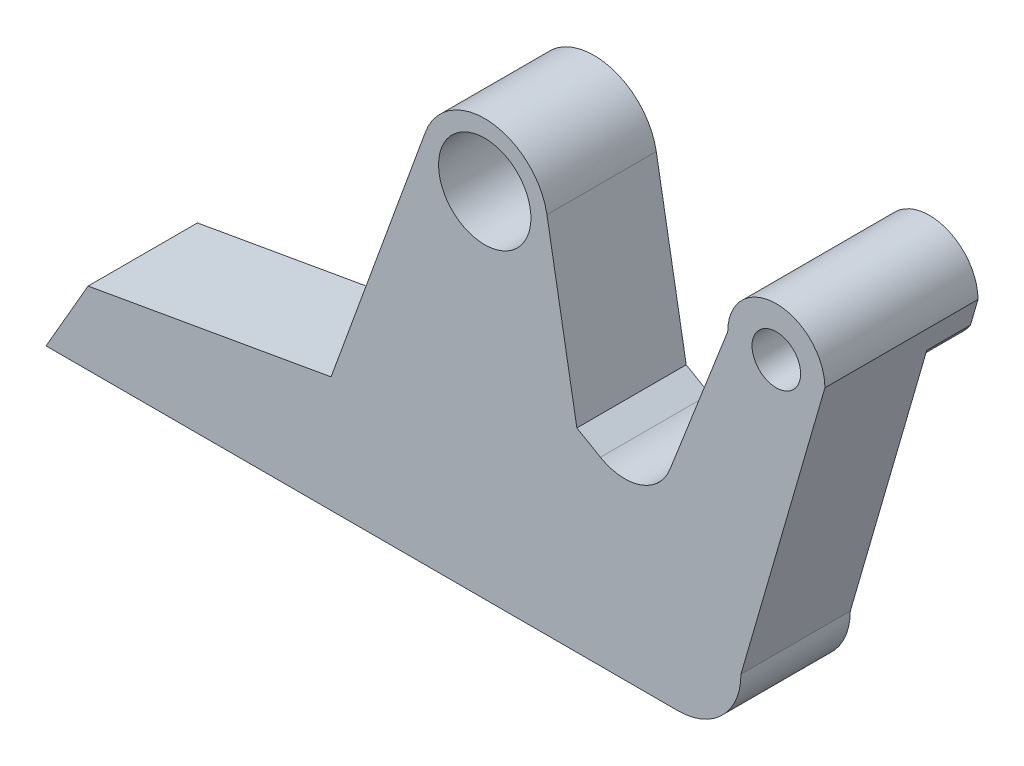
ISO-10303-21;
HEADER;
FILE_DESCRIPTION(('STEP AP214'),'2;1');
FILE_NAME('part.step','',(''),(''),'','','');
FILE_SCHEMA(('AUTOMOTIVE_DESIGN { 1 0 10303 214 1 1 1 1 }'));
ENDSEC;
DATA;
#1=APPLICATION_CONTEXT('core data for automotive mechanical design processes');
#2=APPLICATION_PROTOCOL_DEFINITION('international standard','automotive_design',2000,#1);
#3=PRODUCT_CONTEXT('',#1,'mechanical');
#4=PRODUCT('Part','Part','',(#3));
#5=PRODUCT_RELATED_PRODUCT_CATEGORY('part','',(#4));
#6=PRODUCT_DEFINITION_FORMATION('','',#4);
#7=PRODUCT_DEFINITION_CONTEXT('part definition',#1,'design');
#8=PRODUCT_DEFINITION('design','',#6,#7);
#9=PRODUCT_DEFINITION_SHAPE('','',#8);
#10=(LENGTH_UNIT() NAMED_UNIT(*) SI_UNIT(.MILLI.,.METRE.));
#11=(NAMED_UNIT(*) PLANE_ANGLE_UNIT() SI_UNIT($,.RADIAN.));
#12=(NAMED_UNIT(*) SI_UNIT($,.STERADIAN.) SOLID_ANGLE_UNIT());
#13=UNCERTAINTY_MEASURE_WITH_UNIT(LENGTH_MEASURE(1.E-05),#10,'distance_accuracy_value','');
#14=(GEOMETRIC_REPRESENTATION_CONTEXT(3) GLOBAL_UNCERTAINTY_ASSIGNED_CONTEXT((#13)) GLOBAL_UNIT_ASSIGNED_CONTEXT((#10,
#11,#12)) REPRESENTATION_CONTEXT('',''));
#15=CARTESIAN_POINT('',(0.,0.,0.));
#16=DIRECTION('',(0.,0.,1.));
#17=DIRECTION('',(1.,0.,0.));
#18=AXIS2_PLACEMENT_3D('',#15,#16,#17);
#19=CARTESIAN_POINT('',(0.,0.,-22.5));
#20=DIRECTION('',(0.866025403784436,-0.500000000000004,0.));
#21=DIRECTION('',(0.500000000000004,0.866025403784436,0.));
#22=AXIS2_PLACEMENT_3D('',#19,#20,#21);
#23=PLANE('',#22);
#24=DIRECTION('',(-0.500000000000004,-0.866025403784436,0.));
#25=VECTOR('',#24,1.);
#26=CARTESIAN_POINT('',(0.,0.,-8.24999999999999));
#27=LINE('',#26,#25);
#28=CARTESIAN_POINT('',(1.73205080756889,3.,-8.24999999999999));
#29=VERTEX_POINT('',#28);
#30=CARTESIAN_POINT('',(0.,0.,-8.24999999999999));
#31=VERTEX_POINT('',#30);
#32=EDGE_CURVE('E278',#29,#31,#27,.T.);
#33=ORIENTED_EDGE('',*,*,#32,.T.);
#34=DIRECTION('',(0.,0.,1.));
#35=VECTOR('',#34,1.);
#36=CARTESIAN_POINT('',(0.,0.,-22.5));
#37=LINE('',#36,#35);
#38=CARTESIAN_POINT('',(0.,0.,0.));
#39=VERTEX_POINT('',#38);
#40=EDGE_CURVE('E348',#31,#39,#37,.T.);
#41=ORIENTED_EDGE('',*,*,#40,.T.);
#42=DIRECTION('',(-0.500000000000004,-0.866025403784436,0.));
#43=VECTOR('',#42,1.);
#44=CARTESIAN_POINT('',(0.,0.,0.));
#45=LINE('',#44,#43);
#46=CARTESIAN_POINT('',(8.66025403784448,15.,0.));
#47=VERTEX_POINT('',#46);
#48=EDGE_CURVE('E334',#47,#39,#45,.T.);
#49=ORIENTED_EDGE('',*,*,#48,.F.);
#50=DIRECTION('',(0.,0.,1.));
#51=VECTOR('',#50,1.);
#52=CARTESIAN_POINT('',(8.66025403784448,15.,-22.5));
#53=LINE('',#52,#51);
#54=CARTESIAN_POINT('',(8.66025403784448,15.,-22.5));
#55=VERTEX_POINT('',#54);
#56=EDGE_CURVE('E352',#55,#47,#53,.T.);
#57=ORIENTED_EDGE('',*,*,#56,.F.);
#58=DIRECTION('',(-0.500000000000004,-0.866025403784436,0.));
#59=VECTOR('',#58,1.);
#60=CARTESIAN_POINT('',(0.,0.,-22.5));
#61=LINE('',#60,#59);
#62=CARTESIAN_POINT('',(0.,0.,-22.5));
#63=VERTEX_POINT('',#62);
#64=EDGE_CURVE('E302',#55,#63,#61,.T.);
#65=ORIENTED_EDGE('',*,*,#64,.T.);
#66=CARTESIAN_POINT('',(0.,0.,-14.25));
#67=VERTEX_POINT('',#66);
#68=EDGE_CURVE('E349',#63,#67,#37,.T.);
#69=ORIENTED_EDGE('',*,*,#68,.T.);
#70=DIRECTION('',(-0.500000000000004,-0.866025403784436,0.));
#71=VECTOR('',#70,1.);
#72=CARTESIAN_POINT('',(0.,0.,-14.25));
#73=LINE('',#72,#71);
#74=CARTESIAN_POINT('',(1.73205080756892,3.00000000000001,-14.25));
#75=VERTEX_POINT('',#74);
#76=EDGE_CURVE('E262',#75,#67,#73,.T.);
#77=ORIENTED_EDGE('',*,*,#76,.F.);
#78=DIRECTION('',(0.,0.,-1.));
#79=VECTOR('',#78,1.);
#80=CARTESIAN_POINT('',(1.7320508075689,3.,-22.5));
#81=LINE('',#80,#79);
#82=CARTESIAN_POINT('',(1.73205080756889,3.,-17.25));
#83=VERTEX_POINT('',#82);
#84=EDGE_CURVE('E374',#75,#83,#81,.T.);
#85=ORIENTED_EDGE('',*,*,#84,.T.);
#86=DIRECTION('',(-0.500000000000004,-0.866025403784436,0.));
#87=VECTOR('',#86,1.);
#88=CARTESIAN_POINT('',(0.,0.,-17.25));
#89=LINE('',#88,#87);
#90=CARTESIAN_POINT('',(3.46410161513783,6.00000000000001,-17.25));
#91=VERTEX_POINT('',#90);
#92=EDGE_CURVE('E377',#91,#83,#89,.T.);
#93=ORIENTED_EDGE('',*,*,#92,.F.);
#94=DIRECTION('',(0.,0.,-1.));
#95=VECTOR('',#94,1.);
#96=CARTESIAN_POINT('',(3.46410161513779,6.,-22.5));
#97=LINE('',#96,#95);
#98=CARTESIAN_POINT('',(3.4641016151378,6.,-5.25));
#99=VERTEX_POINT('',#98);
#100=EDGE_CURVE('E380',#99,#91,#97,.T.);
#101=ORIENTED_EDGE('',*,*,#100,.F.);
#102=DIRECTION('',(-0.500000000000004,-0.866025403784436,0.));
#103=VECTOR('',#102,1.);
#104=CARTESIAN_POINT('',(0.,0.,-5.25));
#105=LINE('',#104,#103);
#106=CARTESIAN_POINT('',(1.73205080756892,3.00000000000001,-5.25));
#107=VERTEX_POINT('',#106);
#108=EDGE_CURVE('E383',#99,#107,#105,.T.);
#109=ORIENTED_EDGE('',*,*,#108,.T.);
#110=DIRECTION('',(0.,0.,-1.));
#111=VECTOR('',#110,1.);
#112=CARTESIAN_POINT('',(1.7320508075689,3.,-22.5));
#113=LINE('',#112,#111);
#114=EDGE_CURVE('E386',#107,#29,#113,.T.);
#115=ORIENTED_EDGE('',*,*,#114,.T.);
#116=EDGE_LOOP('',(#33,#41,#49,#57,#65,#69,#77,#85,#93,#101,#109,#115));
#117=FACE_BOUND('',#116,.T.);
#118=ADVANCED_FACE('F75',(#117),#23,.F.);
#119=CARTESIAN_POINT('',(0.,0.,-22.5));
#120=DIRECTION('',(0.,1.,0.));
#121=DIRECTION('',(-1.,0.,0.));
#122=AXIS2_PLACEMENT_3D('',#119,#120,#121);
#123=PLANE('',#122);
#124=DIRECTION('',(-1.,0.,0.));
#125=VECTOR('',#124,1.);
#126=CARTESIAN_POINT('',(130.,0.,-8.24999999999999));
#127=LINE('',#126,#125);
#128=CARTESIAN_POINT('',(130.,0.,-8.25));
#129=VERTEX_POINT('',#128);
#130=EDGE_CURVE('E260',#129,#31,#127,.T.);
#131=ORIENTED_EDGE('',*,*,#130,.F.);
#132=DIRECTION('',(0.,0.,1.));
#133=VECTOR('',#132,1.);
#134=CARTESIAN_POINT('',(130.,0.,-22.5));
#135=LINE('',#134,#133);
#136=CARTESIAN_POINT('',(130.,0.,0.));
#137=VERTEX_POINT('',#136);
#138=EDGE_CURVE('E310',#129,#137,#135,.T.);
#139=ORIENTED_EDGE('',*,*,#138,.T.);
#140=DIRECTION('',(1.,0.,0.));
#141=VECTOR('',#140,1.);
#142=CARTESIAN_POINT('',(0.,0.,0.));
#143=LINE('',#142,#141);
#144=EDGE_CURVE('E337',#39,#137,#143,.T.);
#145=ORIENTED_EDGE('',*,*,#144,.F.);
#146=ORIENTED_EDGE('',*,*,#40,.F.);
#147=EDGE_LOOP('',(#131,#139,#145,#146));
#148=FACE_BOUND('',#147,.T.);
#149=ADVANCED_FACE('F440',(#148),#123,.F.);
#150=CARTESIAN_POINT('',(130.,13.,-22.5));
#151=DIRECTION('',(0.,0.,1.));
#152=DIRECTION('',(-1.,0.,0.));
#153=AXIS2_PLACEMENT_3D('',#150,#151,#152);
#154=CYLINDRICAL_SURFACE('',#153,13.);
#155=CARTESIAN_POINT('',(130.,13.,0.));
#156=DIRECTION('',(0.,0.,1.));
#157=DIRECTION('',(1.,0.,0.));
#158=AXIS2_PLACEMENT_3D('',#155,#156,#157);
#159=CIRCLE('',#158,13.);
#160=CARTESIAN_POINT('',(143.,13.,0.));
#161=VERTEX_POINT('',#160);
#162=EDGE_CURVE('E281',#137,#161,#159,.T.);
#163=ORIENTED_EDGE('',*,*,#162,.F.);
#164=ORIENTED_EDGE('',*,*,#138,.F.);
#165=DIRECTION('',(0.,0.,1.));
#166=VECTOR('',#165,1.);
#167=CARTESIAN_POINT('',(130.,0.,0.));
#168=LINE('',#167,#166);
#169=CARTESIAN_POINT('',(130.,0.,-14.25));
#170=VERTEX_POINT('',#169);
#171=EDGE_CURVE('E237',#170,#129,#168,.T.);
#172=ORIENTED_EDGE('',*,*,#171,.F.);
#173=CARTESIAN_POINT('',(130.,0.,-22.5));
#174=VERTEX_POINT('',#173);
#175=EDGE_CURVE('E345',#174,#170,#135,.T.);
#176=ORIENTED_EDGE('',*,*,#175,.F.);
#177=CARTESIAN_POINT('',(130.,13.,-22.5));
#178=DIRECTION('',(0.,0.,1.));
#179=DIRECTION('',(1.,0.,0.));
#180=AXIS2_PLACEMENT_3D('',#177,#178,#179);
#181=CIRCLE('',#180,13.);
#182=CARTESIAN_POINT('',(143.,13.,-22.5));
#183=VERTEX_POINT('',#182);
#184=EDGE_CURVE('E282',#174,#183,#181,.T.);
#185=ORIENTED_EDGE('',*,*,#184,.T.);
#186=DIRECTION('',(0.,0.,1.));
#187=VECTOR('',#186,1.);
#188=CARTESIAN_POINT('',(143.,13.,-22.5));
#189=LINE('',#188,#187);
#190=EDGE_CURVE('E371',#183,#161,#189,.T.);
#191=ORIENTED_EDGE('',*,*,#190,.T.);
#192=EDGE_LOOP('',(#163,#164,#172,#176,#185,#191));
#193=FACE_BOUND('',#192,.T.);
#194=ADVANCED_FACE('F415',(#193),#154,.T.);
#195=CARTESIAN_POINT('',(150.274249999417,72.6656318764519,-22.5));
#196=DIRECTION('',(0.,0.,1.));
#197=DIRECTION('',(-1.,0.,0.));
#198=AXIS2_PLACEMENT_3D('',#195,#196,#197);
#199=CYLINDRICAL_SURFACE('',#198,4.99999999999999);
#200=CARTESIAN_POINT('',(150.274249999417,72.6656318764519,0.));
#201=DIRECTION('',(0.,0.,1.));
#202=DIRECTION('',(1.,0.,0.));
#203=AXIS2_PLACEMENT_3D('',#200,#201,#202);
#204=CIRCLE('',#203,4.99999999999999);
#205=CARTESIAN_POINT('',(145.274249999417,72.6656318764519,0.));
#206=VERTEX_POINT('',#205);
#207=EDGE_CURVE('E285',#206,#206,#204,.T.);
#208=CARTESIAN_POINT('',(150.274249999417,72.6656318764519,-31.5));
#209=DIRECTION('',(0.,0.,1.));
#210=DIRECTION('',(1.,0.,0.));
#211=AXIS2_PLACEMENT_3D('',#208,#209,#210);
#212=CIRCLE('',#211,4.99999999999999);
#213=CARTESIAN_POINT('',(145.274249999417,72.6656318764519,-31.5));
#214=VERTEX_POINT('',#213);
#215=EDGE_CURVE('E229',#214,#214,#212,.F.);
#216=CARTESIAN_POINT('',(145.274249999417,72.6656318764519,0.));
#217=CARTESIAN_POINT('',(145.274249999417,72.6656318764519,-0.328125000000003));
#218=CARTESIAN_POINT('',(145.274249999417,72.6656318764519,-0.656250000000003));
#219=CARTESIAN_POINT('',(145.274249999417,72.6656318764519,-1.3125));
#220=CARTESIAN_POINT('',(145.274249999417,72.6656318764519,-1.640625));
#221=CARTESIAN_POINT('',(145.274249999417,72.6656318764519,-2.296875));
#222=CARTESIAN_POINT('',(145.274249999417,72.6656318764519,-2.625));
#223=CARTESIAN_POINT('',(145.274249999417,72.6656318764519,-3.28125));
#224=CARTESIAN_POINT('',(145.274249999417,72.6656318764519,-3.609375));
#225=CARTESIAN_POINT('',(145.274249999417,72.6656318764519,-4.265625));
#226=CARTESIAN_POINT('',(145.274249999417,72.6656318764519,-4.59375));
#227=CARTESIAN_POINT('',(145.274249999417,72.6656318764519,-5.25));
#228=CARTESIAN_POINT('',(145.274249999417,72.6656318764519,-5.578125));
#229=CARTESIAN_POINT('',(145.274249999417,72.6656318764519,-6.234375));
#230=CARTESIAN_POINT('',(145.274249999417,72.6656318764519,-6.5625));
#231=CARTESIAN_POINT('',(145.274249999417,72.6656318764519,-7.21875));
#232=CARTESIAN_POINT('',(145.274249999417,72.6656318764519,-7.546875));
#233=CARTESIAN_POINT('',(145.274249999417,72.6656318764519,-8.203125));
#234=CARTESIAN_POINT('',(145.274249999417,72.6656318764519,-8.53125));
#235=CARTESIAN_POINT('',(145.274249999417,72.6656318764519,-9.18750000000001));
#236=CARTESIAN_POINT('',(145.274249999417,72.6656318764519,-9.515625));
#237=CARTESIAN_POINT('',(145.274249999417,72.6656318764519,-10.171875));
#238=CARTESIAN_POINT('',(145.274249999417,72.6656318764519,-10.5));
#239=CARTESIAN_POINT('',(145.274249999417,72.6656318764519,-11.15625));
#240=CARTESIAN_POINT('',(145.274249999417,72.6656318764519,-11.484375));
#241=CARTESIAN_POINT('',(145.274249999417,72.6656318764519,-12.140625));
#242=CARTESIAN_POINT('',(145.274249999417,72.6656318764519,-12.46875));
#243=CARTESIAN_POINT('',(145.274249999417,72.6656318764519,-13.125));
#244=CARTESIAN_POINT('',(145.274249999417,72.6656318764519,-13.453125));
#245=CARTESIAN_POINT('',(145.274249999417,72.6656318764519,-14.109375));
#246=CARTESIAN_POINT('',(145.274249999417,72.6656318764519,-14.4375));
#247=CARTESIAN_POINT('',(145.274249999417,72.6656318764519,-15.09375));
#248=CARTESIAN_POINT('',(145.274249999417,72.6656318764519,-15.421875));
#249=CARTESIAN_POINT('',(145.274249999417,72.6656318764519,-16.078125));
#250=CARTESIAN_POINT('',(145.274249999417,72.6656318764519,-16.40625));
#251=CARTESIAN_POINT('',(145.274249999417,72.6656318764519,-17.0625));
#252=CARTESIAN_POINT('',(145.274249999417,72.6656318764519,-17.390625));
#253=CARTESIAN_POINT('',(145.274249999417,72.6656318764519,-18.046875));
#254=CARTESIAN_POINT('',(145.274249999417,72.6656318764519,-18.375));
#255=CARTESIAN_POINT('',(145.274249999417,72.6656318764519,-19.03125));
#256=CARTESIAN_POINT('',(145.274249999417,72.6656318764519,-19.359375));
#257=CARTESIAN_POINT('',(145.274249999417,72.6656318764519,-20.015625));
#258=CARTESIAN_POINT('',(145.274249999417,72.6656318764519,-20.34375));
#259=CARTESIAN_POINT('',(145.274249999417,72.6656318764519,-21.));
#260=CARTESIAN_POINT('',(145.274249999417,72.6656318764519,-21.328125));
#261=CARTESIAN_POINT('',(145.274249999417,72.6656318764519,-21.984375));
#262=CARTESIAN_POINT('',(145.274249999417,72.6656318764519,-22.3125));
#263=CARTESIAN_POINT('',(145.274249999417,72.6656318764519,-22.96875));
#264=CARTESIAN_POINT('',(145.274249999417,72.6656318764519,-23.296875));
#265=CARTESIAN_POINT('',(145.274249999417,72.6656318764519,-23.953125));
#266=CARTESIAN_POINT('',(145.274249999417,72.6656318764519,-24.28125));
#267=CARTESIAN_POINT('',(145.274249999417,72.6656318764519,-24.9375));
#268=CARTESIAN_POINT('',(145.274249999417,72.6656318764519,-25.265625));
#269=CARTESIAN_POINT('',(145.274249999417,72.6656318764519,-25.921875));
#270=CARTESIAN_POINT('',(145.274249999417,72.6656318764519,-26.25));
#271=CARTESIAN_POINT('',(145.274249999417,72.6656318764519,-26.90625));
#272=CARTESIAN_POINT('',(145.274249999417,72.6656318764519,-27.234375));
#273=CARTESIAN_POINT('',(145.274249999417,72.6656318764519,-27.890625));
#274=CARTESIAN_POINT('',(145.274249999417,72.6656318764519,-28.21875));
#275=CARTESIAN_POINT('',(145.274249999417,72.6656318764519,-28.875));
#276=CARTESIAN_POINT('',(145.274249999417,72.6656318764519,-29.203125));
#277=CARTESIAN_POINT('',(145.274249999417,72.6656318764519,-29.859375));
#278=CARTESIAN_POINT('',(145.274249999417,72.6656318764519,-30.1875));
#279=CARTESIAN_POINT('',(145.274249999417,72.6656318764519,-30.84375));
#280=CARTESIAN_POINT('',(145.274249999417,72.6656318764519,-31.171875));
#281=CARTESIAN_POINT('',(145.274249999417,72.6656318764519,-31.5));
#282=B_SPLINE_CURVE_WITH_KNOTS('',3,(#216,#217,#218,#219,#220,#221,#222,#223,#224,#225,#226,
#227,#228,#229,#230,#231,#232,#233,#234,#235,#236,#237,#238,#239,#240,#241,#242,#243,#244,#245,
#246,#247,#248,#249,#250,#251,#252,#253,#254,#255,#256,#257,#258,#259,#260,#261,#262,#263,#264,
#265,#266,#267,#268,#269,#270,#271,#272,#273,#274,#275,#276,#277,#278,#279,#280,#281),
.UNSPECIFIED.,.F.,.F.,(4,2,2,2,2,2,2,2,2,2,2,2,2,2,2,2,2,2,2,2,2,2,2,2,2,2,2,2,2,2,2,2,4),(0.,
0.984374999999999,1.96875,2.953125,3.9375,4.921875,5.90625,6.890625,7.875,8.859375,9.84375,
10.828125,11.8125,12.796875,13.78125,14.765625,15.75,16.734375,17.71875,18.703125,19.6875,
20.671875,21.65625,22.640625,23.625,24.609375,25.59375,26.578125,27.5625,28.546875,29.53125,
30.515625,31.5),.UNSPECIFIED.);
#283=EDGE_CURVE('BSEAM506',#206,#214,#282,.T.);
#284=ORIENTED_EDGE('',*,*,#207,.T.);
#285=ORIENTED_EDGE('',*,*,#215,.T.);
#286=ORIENTED_EDGE('',*,*,#283,.T.);
#287=ORIENTED_EDGE('',*,*,#283,.F.);
#288=EDGE_LOOP('',(#284,#286,#285,#287));
#289=FACE_BOUND('',#288,.T.);
#290=ADVANCED_FACE('F506',(#289),#199,.F.);
#291=CARTESIAN_POINT('',(90.2742499994169,72.6656318764519,-22.5));
#292=DIRECTION('',(0.,0.,1.));
#293=DIRECTION('',(-1.,0.,0.));
#294=AXIS2_PLACEMENT_3D('',#291,#292,#293);
#295=CYLINDRICAL_SURFACE('',#294,9.49999999999999);
#296=CARTESIAN_POINT('',(90.2742499994169,72.6656318764519,-22.5));
#297=DIRECTION('',(0.,0.,1.));
#298=DIRECTION('',(1.,0.,0.));
#299=AXIS2_PLACEMENT_3D('',#296,#297,#298);
#300=CIRCLE('',#299,9.49999999999999);
#301=CARTESIAN_POINT('',(80.7742499994169,72.6656318764519,-22.5));
#302=VERTEX_POINT('',#301);
#303=EDGE_CURVE('E307',#302,#302,#300,.T.);
#304=CARTESIAN_POINT('',(90.2742499994169,72.6656318764519,0.));
#305=DIRECTION('',(0.,0.,1.));
#306=DIRECTION('',(1.,0.,0.));
#307=AXIS2_PLACEMENT_3D('',#304,#305,#306);
#308=CIRCLE('',#307,9.49999999999999);
#309=CARTESIAN_POINT('',(80.7742499994169,72.6656318764519,0.));
#310=VERTEX_POINT('',#309);
#311=EDGE_CURVE('E340',#310,#310,#308,.T.);
#312=CARTESIAN_POINT('',(80.7742499994169,72.6656318764519,-22.5));
#313=CARTESIAN_POINT('',(80.7742499994169,72.6656318764519,-22.265625));
#314=CARTESIAN_POINT('',(80.7742499994169,72.6656318764519,-22.03125));
#315=CARTESIAN_POINT('',(80.7742499994169,72.6656318764519,-21.5625));
#316=CARTESIAN_POINT('',(80.7742499994169,72.6656318764519,-21.328125));
#317=CARTESIAN_POINT('',(80.7742499994169,72.6656318764519,-20.859375));
#318=CARTESIAN_POINT('',(80.7742499994169,72.6656318764519,-20.625));
#319=CARTESIAN_POINT('',(80.7742499994169,72.6656318764519,-20.15625));
#320=CARTESIAN_POINT('',(80.7742499994169,72.6656318764519,-19.921875));
#321=CARTESIAN_POINT('',(80.7742499994169,72.6656318764519,-19.453125));
#322=CARTESIAN_POINT('',(80.7742499994169,72.6656318764519,-19.21875));
#323=CARTESIAN_POINT('',(80.7742499994169,72.6656318764519,-18.75));
#324=CARTESIAN_POINT('',(80.7742499994169,72.6656318764519,-18.515625));
#325=CARTESIAN_POINT('',(80.7742499994169,72.6656318764519,-18.046875));
#326=CARTESIAN_POINT('',(80.7742499994169,72.6656318764519,-17.8125));
#327=CARTESIAN_POINT('',(80.7742499994169,72.6656318764519,-17.34375));
#328=CARTESIAN_POINT('',(80.7742499994169,72.6656318764519,-17.109375));
#329=CARTESIAN_POINT('',(80.7742499994169,72.6656318764519,-16.640625));
#330=CARTESIAN_POINT('',(80.7742499994169,72.6656318764519,-16.40625));
#331=CARTESIAN_POINT('',(80.7742499994169,72.6656318764519,-15.9375));
#332=CARTESIAN_POINT('',(80.7742499994169,72.6656318764519,-15.703125));
#333=CARTESIAN_POINT('',(80.7742499994169,72.6656318764519,-15.234375));
#334=CARTESIAN_POINT('',(80.7742499994169,72.6656318764519,-15.));
#335=CARTESIAN_POINT('',(80.7742499994169,72.6656318764519,-14.53125));
#336=CARTESIAN_POINT('',(80.7742499994169,72.6656318764519,-14.296875));
#337=CARTESIAN_POINT('',(80.7742499994169,72.6656318764519,-13.828125));
#338=CARTESIAN_POINT('',(80.7742499994169,72.6656318764519,-13.59375));
#339=CARTESIAN_POINT('',(80.7742499994169,72.6656318764519,-13.125));
#340=CARTESIAN_POINT('',(80.7742499994169,72.6656318764519,-12.890625));
#341=CARTESIAN_POINT('',(80.7742499994169,72.6656318764519,-12.421875));
#342=CARTESIAN_POINT('',(80.7742499994169,72.6656318764519,-12.1875));
#343=CARTESIAN_POINT('',(80.7742499994169,72.6656318764519,-11.71875));
#344=CARTESIAN_POINT('',(80.7742499994169,72.6656318764519,-11.484375));
#345=CARTESIAN_POINT('',(80.7742499994169,72.6656318764519,-11.015625));
#346=CARTESIAN_POINT('',(80.7742499994169,72.6656318764519,-10.78125));
#347=CARTESIAN_POINT('',(80.7742499994169,72.6656318764519,-10.3125));
#348=CARTESIAN_POINT('',(80.7742499994169,72.6656318764519,-10.078125));
#349=CARTESIAN_POINT('',(80.7742499994169,72.6656318764519,-9.609375));
#350=CARTESIAN_POINT('',(80.7742499994169,72.6656318764519,-9.375));
#351=CARTESIAN_POINT('',(80.7742499994169,72.6656318764519,-8.90625));
#352=CARTESIAN_POINT('',(80.7742499994169,72.6656318764519,-8.671875));
#353=CARTESIAN_POINT('',(80.7742499994169,72.6656318764519,-8.203125));
#354=CARTESIAN_POINT('',(80.7742499994169,72.6656318764519,-7.96875));
#355=CARTESIAN_POINT('',(80.7742499994169,72.6656318764519,-7.5));
#356=CARTESIAN_POINT('',(80.7742499994169,72.6656318764519,-7.265625));
#357=CARTESIAN_POINT('',(80.7742499994169,72.6656318764519,-6.796875));
#358=CARTESIAN_POINT('',(80.7742499994169,72.6656318764519,-6.5625));
#359=CARTESIAN_POINT('',(80.7742499994169,72.6656318764519,-6.09375));
#360=CARTESIAN_POINT('',(80.7742499994169,72.6656318764519,-5.859375));
#361=CARTESIAN_POINT('',(80.7742499994169,72.6656318764519,-5.390625));
#362=CARTESIAN_POINT('',(80.7742499994169,72.6656318764519,-5.15625));
#363=CARTESIAN_POINT('',(80.7742499994169,72.6656318764519,-4.6875));
#364=CARTESIAN_POINT('',(80.7742499994169,72.6656318764519,-4.453125));
#365=CARTESIAN_POINT('',(80.7742499994169,72.6656318764519,-3.984375));
#366=CARTESIAN_POINT('',(80.7742499994169,72.6656318764519,-3.75));
#367=CARTESIAN_POINT('',(80.7742499994169,72.6656318764519,-3.28125));
#368=CARTESIAN_POINT('',(80.7742499994169,72.6656318764519,-3.046875));
#369=CARTESIAN_POINT('',(80.7742499994169,72.6656318764519,-2.578125));
#370=CARTESIAN_POINT('',(80.7742499994169,72.6656318764519,-2.34375));
#371=CARTESIAN_POINT('',(80.7742499994169,72.6656318764519,-1.875));
#372=CARTESIAN_POINT('',(80.7742499994169,72.6656318764519,-1.640625));
#373=CARTESIAN_POINT('',(80.7742499994169,72.6656318764519,-1.171875));
#374=CARTESIAN_POINT('',(80.7742499994169,72.6656318764519,-0.937500000000003));
#375=CARTESIAN_POINT('',(80.7742499994169,72.6656318764519,-0.468750000000003));
#376=CARTESIAN_POINT('',(80.7742499994169,72.6656318764519,-0.234375000000003));
#377=CARTESIAN_POINT('',(80.7742499994169,72.6656318764519,0.));
#378=B_SPLINE_CURVE_WITH_KNOTS('',3,(#312,#313,#314,#315,#316,#317,#318,#319,#320,#321,#322,
#323,#324,#325,#326,#327,#328,#329,#330,#331,#332,#333,#334,#335,#336,#337,#338,#339,#340,#341,
#342,#343,#344,#345,#346,#347,#348,#349,#350,#351,#352,#353,#354,#355,#356,#357,#358,#359,#360,
#361,#362,#363,#364,#365,#366,#367,#368,#369,#370,#371,#372,#373,#374,#375,#376,#377),
.UNSPECIFIED.,.F.,.F.,(4,2,2,2,2,2,2,2,2,2,2,2,2,2,2,2,2,2,2,2,2,2,2,2,2,2,2,2,2,2,2,2,4),(0.,
0.703125000000002,1.40625,2.109375,2.8125,3.515625,4.21875,4.921875,5.625,6.328125,7.03125,
7.734375,8.4375,9.140625,9.84375,10.546875,11.25,11.953125,12.65625,13.359375,14.0625,14.765625,
15.46875,16.171875,16.875,17.578125,18.28125,18.984375,19.6875,20.390625,21.09375,21.796875,
22.5),.UNSPECIFIED.);
#379=EDGE_CURVE('BSEAM504',#302,#310,#378,.T.);
#380=ORIENTED_EDGE('',*,*,#303,.F.);
#381=ORIENTED_EDGE('',*,*,#311,.T.);
#382=ORIENTED_EDGE('',*,*,#379,.T.);
#383=ORIENTED_EDGE('',*,*,#379,.F.);
#384=EDGE_LOOP('',(#380,#382,#381,#383));
#385=FACE_BOUND('',#384,.T.);
#386=ADVANCED_FACE('F504',(#385),#295,.F.);
#387=CARTESIAN_POINT('',(128.46802548352,-37.193753243559,-22.5));
#388=DIRECTION('',(0.960552999077482,-0.27809699020891,0.));
#389=DIRECTION('',(0.27809699020891,0.960552999077482,0.));
#390=AXIS2_PLACEMENT_3D('',#387,#388,#389);
#391=PLANE('',#390);
#392=DIRECTION('',(-0.27809699020891,-0.960552999077482,0.));
#393=VECTOR('',#392,1.);
#394=CARTESIAN_POINT('',(128.46802548352,-37.193753243559,0.));
#395=LINE('',#394,#393);
#396=CARTESIAN_POINT('',(160.274249999417,72.6656318764519,0.));
#397=VERTEX_POINT('',#396);
#398=EDGE_CURVE('E313',#397,#161,#395,.T.);
#399=ORIENTED_EDGE('',*,*,#398,.T.);
#400=ORIENTED_EDGE('',*,*,#190,.F.);
#401=DIRECTION('',(-0.27809699020891,-0.960552999077482,0.));
#402=VECTOR('',#401,1.);
#403=CARTESIAN_POINT('',(128.46802548352,-37.193753243559,-22.5));
#404=LINE('',#403,#402);
#405=CARTESIAN_POINT('',(158.727491280152,67.3230939168601,-22.5));
#406=VERTEX_POINT('',#405);
#407=EDGE_CURVE('E236',#406,#183,#404,.T.);
#408=ORIENTED_EDGE('',*,*,#407,.F.);
#409=DIRECTION('',(0.,0.,1.));
#410=VECTOR('',#409,1.);
#411=CARTESIAN_POINT('',(158.727491280152,67.3230939168601,-31.5));
#412=LINE('',#411,#410);
#413=CARTESIAN_POINT('',(158.727491280152,67.3230939168601,-31.5));
#414=VERTEX_POINT('',#413);
#415=EDGE_CURVE('E222',#414,#406,#412,.T.);
#416=ORIENTED_EDGE('',*,*,#415,.F.);
#417=DIRECTION('',(0.27809699020891,0.960552999077482,0.));
#418=VECTOR('',#417,1.);
#419=CARTESIAN_POINT('',(128.46802548352,-37.193753243559,-31.5));
#420=LINE('',#419,#418);
#421=CARTESIAN_POINT('',(160.274249999417,72.6656318764519,-31.5));
#422=VERTEX_POINT('',#421);
#423=EDGE_CURVE('E228',#414,#422,#420,.T.);
#424=ORIENTED_EDGE('',*,*,#423,.T.);
#425=DIRECTION('',(0.,0.,1.));
#426=VECTOR('',#425,1.);
#427=CARTESIAN_POINT('',(160.274249999417,72.6656318764519,-22.5));
#428=LINE('',#427,#426);
#429=EDGE_CURVE('E225',#422,#397,#428,.T.);
#430=ORIENTED_EDGE('',*,*,#429,.T.);
#431=EDGE_LOOP('',(#399,#400,#408,#416,#424,#430));
#432=FACE_BOUND('',#431,.T.);
#433=ADVANCED_FACE('F234',(#432),#391,.T.);
#434=CARTESIAN_POINT('',(150.274249999417,72.6656318764519,-22.5));
#435=DIRECTION('',(0.,0.,1.));
#436=DIRECTION('',(-1.,0.,0.));
#437=AXIS2_PLACEMENT_3D('',#434,#435,#436);
#438=CYLINDRICAL_SURFACE('',#437,10.);
#439=CARTESIAN_POINT('',(150.274249999417,72.6656318764519,0.));
#440=DIRECTION('',(0.,0.,1.));
#441=DIRECTION('',(1.,0.,0.));
#442=AXIS2_PLACEMENT_3D('',#439,#440,#441);
#443=CIRCLE('',#442,10.);
#444=CARTESIAN_POINT('',(140.274249999417,72.6656318764519,0.));
#445=VERTEX_POINT('',#444);
#446=EDGE_CURVE('E315',#397,#445,#443,.T.);
#447=ORIENTED_EDGE('',*,*,#446,.F.);
#448=ORIENTED_EDGE('',*,*,#429,.F.);
#449=CARTESIAN_POINT('',(150.274249999417,72.6656318764519,-31.5));
#450=DIRECTION('',(0.,0.,1.));
#451=DIRECTION('',(1.,0.,0.));
#452=AXIS2_PLACEMENT_3D('',#449,#450,#451);
#453=CIRCLE('',#452,10.);
#454=EDGE_CURVE('E217',#422,#414,#453,.T.);
#455=ORIENTED_EDGE('',*,*,#454,.T.);
#456=ORIENTED_EDGE('',*,*,#415,.T.);
#457=CARTESIAN_POINT('',(150.274249999417,72.6656318764519,-22.5));
#458=DIRECTION('',(0.,0.,1.));
#459=DIRECTION('',(1.,0.,0.));
#460=AXIS2_PLACEMENT_3D('',#457,#458,#459);
#461=CIRCLE('',#460,10.);
#462=CARTESIAN_POINT('',(140.274249999417,72.6656318764519,-22.5));
#463=VERTEX_POINT('',#462);
#464=EDGE_CURVE('E12',#463,#406,#461,.T.);
#465=ORIENTED_EDGE('',*,*,#464,.F.);
#466=DIRECTION('',(0.,0.,1.));
#467=VECTOR('',#466,1.);
#468=CARTESIAN_POINT('',(140.274249999417,72.6656318764519,-22.5));
#469=LINE('',#468,#467);
#470=EDGE_CURVE('E367',#463,#445,#469,.T.);
#471=ORIENTED_EDGE('',*,*,#470,.T.);
#472=EDGE_LOOP('',(#447,#448,#455,#456,#465,#471));
#473=FACE_BOUND('',#472,.T.);
#474=ADVANCED_FACE('F219',(#473),#438,.T.);
#475=CARTESIAN_POINT('',(97.1470145889608,-37.8949125842213,-22.5));
#476=DIRECTION('',(0.931629956112682,-0.363408344529238,0.));
#477=DIRECTION('',(0.363408344529238,0.931629956112682,0.));
#478=AXIS2_PLACEMENT_3D('',#475,#476,#477);
#479=PLANE('',#478);
#480=DIRECTION('',(-0.363408344529238,-0.931629956112683,0.));
#481=VECTOR('',#480,1.);
#482=CARTESIAN_POINT('',(97.1470145889608,-37.8949125842213,0.));
#483=LINE('',#482,#481);
#484=CARTESIAN_POINT('',(128.400519825275,42.2262573063394,0.));
#485=VERTEX_POINT('',#484);
#486=EDGE_CURVE('E318',#445,#485,#483,.T.);
#487=ORIENTED_EDGE('',*,*,#486,.F.);
#488=ORIENTED_EDGE('',*,*,#470,.F.);
#489=DIRECTION('',(-0.363408344529238,-0.931629956112683,0.));
#490=VECTOR('',#489,1.);
#491=CARTESIAN_POINT('',(97.1470145889608,-37.8949125842213,-22.5));
#492=LINE('',#491,#490);
#493=CARTESIAN_POINT('',(128.400519825275,42.2262573063394,-22.5));
#494=VERTEX_POINT('',#493);
#495=EDGE_CURVE('E287',#463,#494,#492,.T.);
#496=ORIENTED_EDGE('',*,*,#495,.T.);
#497=DIRECTION('',(0.,0.,1.));
#498=VECTOR('',#497,1.);
#499=CARTESIAN_POINT('',(128.400519825275,42.2262573063394,-22.5));
#500=LINE('',#499,#498);
#501=EDGE_CURVE('E391',#485,#494,#500,.F.);
#502=ORIENTED_EDGE('',*,*,#501,.F.);
#503=EDGE_LOOP('',(#487,#488,#496,#502));
#504=FACE_BOUND('',#503,.T.);
#505=ADVANCED_FACE('F411',(#504),#479,.F.);
#506=CARTESIAN_POINT('',(44.6291651245991,77.2999814951863,-22.5));
#507=DIRECTION('',(0.500000000000001,0.866025403784438,0.));
#508=DIRECTION('',(-0.866025403784438,0.500000000000002,0.));
#509=AXIS2_PLACEMENT_3D('',#506,#507,#508);
#510=PLANE('',#509);
#511=DIRECTION('',(0.866025403784438,-0.500000000000001,0.));
#512=VECTOR('',#511,1.);
#513=CARTESIAN_POINT('',(44.6291651245991,77.2999814951863,-22.5));
#514=LINE('',#513,#512);
#515=CARTESIAN_POINT('',(109.23462819564,40.,-22.5));
#516=VERTEX_POINT('',#515);
#517=CARTESIAN_POINT('',(114.084220264148,37.2000867137874,-22.5));
#518=VERTEX_POINT('',#517);
#519=EDGE_CURVE('E290',#516,#518,#514,.T.);
#520=ORIENTED_EDGE('',*,*,#519,.F.);
#521=DIRECTION('',(0.,0.,1.));
#522=VECTOR('',#521,1.);
#523=CARTESIAN_POINT('',(109.23462819564,40.,-22.5));
#524=LINE('',#523,#522);
#525=CARTESIAN_POINT('',(109.23462819564,40.,0.));
#526=VERTEX_POINT('',#525);
#527=EDGE_CURVE('E364',#516,#526,#524,.T.);
#528=ORIENTED_EDGE('',*,*,#527,.T.);
#529=DIRECTION('',(0.866025403784438,-0.500000000000001,0.));
#530=VECTOR('',#529,1.);
#531=CARTESIAN_POINT('',(44.6291651245991,77.2999814951863,0.));
#532=LINE('',#531,#530);
#533=CARTESIAN_POINT('',(114.084220264148,37.2000867137874,0.));
#534=VERTEX_POINT('',#533);
#535=EDGE_CURVE('E321',#526,#534,#532,.T.);
#536=ORIENTED_EDGE('',*,*,#535,.T.);
#537=DIRECTION('',(0.,0.,1.));
#538=VECTOR('',#537,1.);
#539=CARTESIAN_POINT('',(114.084220264148,37.2000867137874,-22.5));
#540=LINE('',#539,#538);
#541=EDGE_CURVE('E389',#518,#534,#540,.T.);
#542=ORIENTED_EDGE('',*,*,#541,.F.);
#543=EDGE_LOOP('',(#520,#528,#536,#542));
#544=FACE_BOUND('',#543,.T.);
#545=ADVANCED_FACE('F395',(#544),#510,.T.);
#546=CARTESIAN_POINT('',(112.781203989201,19.886369180081,-22.5));
#547=DIRECTION('',(0.984807753012208,0.173648177666928,0.));
#548=DIRECTION('',(-0.173648177666928,0.984807753012209,0.));
#549=AXIS2_PLACEMENT_3D('',#546,#547,#548);
#550=PLANE('',#549);
#551=DIRECTION('',(0.173648177666928,-0.984807753012209,0.));
#552=VECTOR('',#551,1.);
#553=CARTESIAN_POINT('',(112.781203989201,19.886369180081,0.));
#554=LINE('',#553,#552);
#555=CARTESIAN_POINT('',(103.076750788576,74.9230581861219,0.));
#556=VERTEX_POINT('',#555);
#557=EDGE_CURVE('E324',#556,#526,#554,.T.);
#558=ORIENTED_EDGE('',*,*,#557,.T.);
#559=ORIENTED_EDGE('',*,*,#527,.F.);
#560=DIRECTION('',(0.173648177666928,-0.984807753012209,0.));
#561=VECTOR('',#560,1.);
#562=CARTESIAN_POINT('',(112.781203989201,19.886369180081,-22.5));
#563=LINE('',#562,#561);
#564=CARTESIAN_POINT('',(103.076750788576,74.9230581861219,-22.5));
#565=VERTEX_POINT('',#564);
#566=EDGE_CURVE('E292',#565,#516,#563,.T.);
#567=ORIENTED_EDGE('',*,*,#566,.F.);
#568=DIRECTION('',(0.,0.,1.));
#569=VECTOR('',#568,1.);
#570=CARTESIAN_POINT('',(103.076750788576,74.9230581861219,-22.5));
#571=LINE('',#570,#569);
#572=EDGE_CURVE('E361',#565,#556,#571,.T.);
#573=ORIENTED_EDGE('',*,*,#572,.T.);
#574=EDGE_LOOP('',(#558,#559,#567,#573));
#575=FACE_BOUND('',#574,.T.);
#576=ADVANCED_FACE('F403',(#575),#550,.T.);
#577=CARTESIAN_POINT('',(90.2742499994169,72.6656318764519,-22.5));
#578=DIRECTION('',(0.,0.,1.));
#579=DIRECTION('',(-1.,0.,0.));
#580=AXIS2_PLACEMENT_3D('',#577,#578,#579);
#581=CYLINDRICAL_SURFACE('',#580,13.);
#582=CARTESIAN_POINT('',(90.2742499994169,72.6656318764519,0.));
#583=DIRECTION('',(0.,0.,1.));
#584=DIRECTION('',(1.,0.,0.));
#585=AXIS2_PLACEMENT_3D('',#582,#583,#584);
#586=CIRCLE('',#585,13.);
#587=CARTESIAN_POINT('',(78.0582459292001,77.1118937396856,0.));
#588=VERTEX_POINT('',#587);
#589=EDGE_CURVE('E326',#556,#588,#586,.T.);
#590=ORIENTED_EDGE('',*,*,#589,.F.);
#591=ORIENTED_EDGE('',*,*,#572,.F.);
#592=CARTESIAN_POINT('',(90.2742499994169,72.6656318764519,-22.5));
#593=DIRECTION('',(0.,0.,1.));
#594=DIRECTION('',(1.,0.,0.));
#595=AXIS2_PLACEMENT_3D('',#592,#593,#594);
#596=CIRCLE('',#595,13.);
#597=CARTESIAN_POINT('',(78.0582459292001,77.1118937396856,-22.5));
#598=VERTEX_POINT('',#597);
#599=EDGE_CURVE('E294',#565,#598,#596,.T.);
#600=ORIENTED_EDGE('',*,*,#599,.T.);
#601=DIRECTION('',(0.,0.,1.));
#602=VECTOR('',#601,1.);
#603=CARTESIAN_POINT('',(78.0582459292001,77.1118937396856,-22.5));
#604=LINE('',#603,#602);
#605=EDGE_CURVE('E358',#598,#588,#604,.T.);
#606=ORIENTED_EDGE('',*,*,#605,.T.);
#607=EDGE_LOOP('',(#590,#591,#600,#606));
#608=FACE_BOUND('',#607,.T.);
#609=ADVANCED_FACE('F434',(#608),#581,.T.);
#610=CARTESIAN_POINT('',(44.1438808037713,-16.0670586375682,-22.5));
#611=DIRECTION('',(0.939692620785907,-0.342020143325673,0.));
#612=DIRECTION('',(0.342020143325673,0.939692620785907,0.));
#613=AXIS2_PLACEMENT_3D('',#610,#611,#612);
#614=PLANE('',#613);
#615=DIRECTION('',(-0.342020143325673,-0.939692620785907,0.));
#616=VECTOR('',#615,1.);
#617=CARTESIAN_POINT('',(44.1438808037713,-16.0670586375682,0.));
#618=LINE('',#617,#616);
#619=CARTESIAN_POINT('',(58.6602540378445,23.8163490354229,0.));
#620=VERTEX_POINT('',#619);
#621=EDGE_CURVE('E329',#588,#620,#618,.T.);
#622=ORIENTED_EDGE('',*,*,#621,.F.);
#623=ORIENTED_EDGE('',*,*,#605,.F.);
#624=DIRECTION('',(-0.342020143325673,-0.939692620785907,0.));
#625=VECTOR('',#624,1.);
#626=CARTESIAN_POINT('',(44.1438808037713,-16.0670586375682,-22.5));
#627=LINE('',#626,#625);
#628=CARTESIAN_POINT('',(58.6602540378445,23.8163490354229,-22.5));
#629=VERTEX_POINT('',#628);
#630=EDGE_CURVE('E297',#598,#629,#627,.T.);
#631=ORIENTED_EDGE('',*,*,#630,.T.);
#632=DIRECTION('',(0.,0.,1.));
#633=VECTOR('',#632,1.);
#634=CARTESIAN_POINT('',(58.6602540378445,23.8163490354229,-22.5));
#635=LINE('',#634,#633);
#636=EDGE_CURVE('E355',#629,#620,#635,.T.);
#637=ORIENTED_EDGE('',*,*,#636,.T.);
#638=EDGE_LOOP('',(#622,#623,#631,#637));
#639=FACE_BOUND('',#638,.T.);
#640=ADVANCED_FACE('F432',(#639),#614,.F.);
#641=CARTESIAN_POINT('',(-2.30401246276711,13.0667039922643,-22.5));
#642=DIRECTION('',(0.173648177666924,-0.984807753012209,0.));
#643=DIRECTION('',(0.984807753012209,0.173648177666924,0.));
#644=AXIS2_PLACEMENT_3D('',#641,#642,#643);
#645=PLANE('',#644);
#646=DIRECTION('',(-0.984807753012209,-0.173648177666924,0.));
#647=VECTOR('',#646,1.);
#648=CARTESIAN_POINT('',(-2.30401246276711,13.0667039922643,0.));
#649=LINE('',#648,#647);
#650=EDGE_CURVE('E332',#620,#47,#649,.T.);
#651=ORIENTED_EDGE('',*,*,#650,.F.);
#652=ORIENTED_EDGE('',*,*,#636,.F.);
#653=DIRECTION('',(-0.984807753012209,-0.173648177666924,0.));
#654=VECTOR('',#653,1.);
#655=CARTESIAN_POINT('',(-2.30401246276711,13.0667039922643,-22.5));
#656=LINE('',#655,#654);
#657=EDGE_CURVE('E300',#629,#55,#656,.T.);
#658=ORIENTED_EDGE('',*,*,#657,.T.);
#659=ORIENTED_EDGE('',*,*,#56,.T.);
#660=EDGE_LOOP('',(#651,#652,#658,#659));
#661=FACE_BOUND('',#660,.T.);
#662=ADVANCED_FACE('F429',(#661),#645,.F.);
#663=ORIENTED_EDGE('',*,*,#68,.F.);
#664=DIRECTION('',(1.,0.,0.));
#665=VECTOR('',#664,1.);
#666=CARTESIAN_POINT('',(0.,0.,-22.5));
#667=LINE('',#666,#665);
#668=EDGE_CURVE('E305',#63,#174,#667,.T.);
#669=ORIENTED_EDGE('',*,*,#668,.T.);
#670=ORIENTED_EDGE('',*,*,#175,.T.);
#671=DIRECTION('',(-1.,0.,0.));
#672=VECTOR('',#671,1.);
#673=CARTESIAN_POINT('',(130.,0.,-14.25));
#674=LINE('',#673,#672);
#675=EDGE_CURVE('E259',#170,#67,#674,.T.);
#676=ORIENTED_EDGE('',*,*,#675,.T.);
#677=EDGE_LOOP('',(#663,#669,#670,#676));
#678=FACE_BOUND('',#677,.T.);
#679=ADVANCED_FACE('F420',(#678),#123,.F.);
#680=CARTESIAN_POINT('',(0.,0.,0.));
#681=DIRECTION('',(0.,0.,-1.));
#682=DIRECTION('',(1.,0.,0.));
#683=AXIS2_PLACEMENT_3D('',#680,#681,#682);
#684=PLANE('',#683);
#685=ORIENTED_EDGE('',*,*,#398,.F.);
#686=ORIENTED_EDGE('',*,*,#446,.T.);
#687=ORIENTED_EDGE('',*,*,#486,.T.);
#688=CARTESIAN_POINT('',(119.084220264148,45.8603407516318,0.));
#689=DIRECTION('',(0.,0.,1.));
#690=DIRECTION('',(1.,0.,0.));
#691=AXIS2_PLACEMENT_3D('',#688,#689,#690);
#692=CIRCLE('',#691,10.);
#693=EDGE_CURVE('E97',#534,#485,#692,.T.);
#694=ORIENTED_EDGE('',*,*,#693,.F.);
#695=ORIENTED_EDGE('',*,*,#535,.F.);
#696=ORIENTED_EDGE('',*,*,#557,.F.);
#697=ORIENTED_EDGE('',*,*,#589,.T.);
#698=ORIENTED_EDGE('',*,*,#621,.T.);
#699=ORIENTED_EDGE('',*,*,#650,.T.);
#700=ORIENTED_EDGE('',*,*,#48,.T.);
#701=ORIENTED_EDGE('',*,*,#144,.T.);
#702=ORIENTED_EDGE('',*,*,#162,.T.);
#703=EDGE_LOOP('',(#685,#686,#687,#694,#695,#696,#697,#698,#699,#700,#701,#702));
#704=FACE_BOUND('',#703,.T.);
#705=ORIENTED_EDGE('',*,*,#311,.F.);
#706=EDGE_LOOP('',(#705));
#707=FACE_BOUND('',#706,.T.);
#708=ORIENTED_EDGE('',*,*,#207,.F.);
#709=EDGE_LOOP('',(#708));
#710=FACE_BOUND('',#709,.T.);
#711=ADVANCED_FACE('F407',(#704,#707,#710),#684,.F.);
#712=CARTESIAN_POINT('',(0.,0.,-22.5));
#713=DIRECTION('',(0.,0.,-1.));
#714=DIRECTION('',(1.,0.,0.));
#715=AXIS2_PLACEMENT_3D('',#712,#713,#714);
#716=PLANE('',#715);
#717=ORIENTED_EDGE('',*,*,#464,.T.);
#718=ORIENTED_EDGE('',*,*,#407,.T.);
#719=ORIENTED_EDGE('',*,*,#184,.F.);
#720=ORIENTED_EDGE('',*,*,#668,.F.);
#721=ORIENTED_EDGE('',*,*,#64,.F.);
#722=ORIENTED_EDGE('',*,*,#657,.F.);
#723=ORIENTED_EDGE('',*,*,#630,.F.);
#724=ORIENTED_EDGE('',*,*,#599,.F.);
#725=ORIENTED_EDGE('',*,*,#566,.T.);
#726=ORIENTED_EDGE('',*,*,#519,.T.);
#727=CARTESIAN_POINT('',(119.084220264148,45.8603407516318,-22.5));
#728=DIRECTION('',(0.,0.,1.));
#729=DIRECTION('',(1.,0.,0.));
#730=AXIS2_PLACEMENT_3D('',#727,#728,#729);
#731=CIRCLE('',#730,10.);
#732=EDGE_CURVE('E79',#494,#518,#731,.F.);
#733=ORIENTED_EDGE('',*,*,#732,.F.);
#734=ORIENTED_EDGE('',*,*,#495,.F.);
#735=EDGE_LOOP('',(#717,#718,#719,#720,#721,#722,#723,#724,#725,#726,#733,#734));
#736=FACE_BOUND('',#735,.T.);
#737=ORIENTED_EDGE('',*,*,#303,.T.);
#738=EDGE_LOOP('',(#737));
#739=FACE_BOUND('',#738,.T.);
#740=ADVANCED_FACE('F397',(#736,#739),#716,.T.);
#741=CARTESIAN_POINT('',(130.,3.,0.));
#742=DIRECTION('',(0.,1.,0.));
#743=DIRECTION('',(0.,0.,-1.));
#744=AXIS2_PLACEMENT_3D('',#741,#742,#743);
#745=PLANE('',#744);
#746=ORIENTED_EDGE('',*,*,#114,.F.);
#747=DIRECTION('',(-1.,0.,0.));
#748=VECTOR('',#747,1.);
#749=CARTESIAN_POINT('',(130.,3.,-5.25));
#750=LINE('',#749,#748);
#751=CARTESIAN_POINT('',(130.,3.,-5.25));
#752=VERTEX_POINT('',#751);
#753=EDGE_CURVE('E265',#752,#107,#750,.T.);
#754=ORIENTED_EDGE('',*,*,#753,.F.);
#755=DIRECTION('',(0.,0.,1.));
#756=VECTOR('',#755,1.);
#757=CARTESIAN_POINT('',(130.,3.,0.));
#758=LINE('',#757,#756);
#759=CARTESIAN_POINT('',(130.,3.00000000000001,-8.24999999999999));
#760=VERTEX_POINT('',#759);
#761=EDGE_CURVE('E254',#760,#752,#758,.T.);
#762=ORIENTED_EDGE('',*,*,#761,.F.);
#763=DIRECTION('',(-1.,0.,0.));
#764=VECTOR('',#763,1.);
#765=CARTESIAN_POINT('',(130.,3.00000000000001,-8.24999999999999));
#766=LINE('',#765,#764);
#767=EDGE_CURVE('E263',#760,#29,#766,.T.);
#768=ORIENTED_EDGE('',*,*,#767,.T.);
#769=EDGE_LOOP('',(#746,#754,#762,#768));
#770=FACE_BOUND('',#769,.T.);
#771=ADVANCED_FACE('F471',(#770),#745,.T.);
#772=CARTESIAN_POINT('',(130.,0.,-5.25));
#773=DIRECTION('',(0.,0.,-1.));
#774=DIRECTION('',(0.,-1.,0.));
#775=AXIS2_PLACEMENT_3D('',#772,#773,#774);
#776=PLANE('',#775);
#777=ORIENTED_EDGE('',*,*,#108,.F.);
#778=DIRECTION('',(-1.,0.,0.));
#779=VECTOR('',#778,1.);
#780=CARTESIAN_POINT('',(130.,6.,-5.25));
#781=LINE('',#780,#779);
#782=CARTESIAN_POINT('',(130.,6.,-5.25));
#783=VERTEX_POINT('',#782);
#784=EDGE_CURVE('E267',#783,#99,#781,.T.);
#785=ORIENTED_EDGE('',*,*,#784,.F.);
#786=DIRECTION('',(0.,1.,0.));
#787=VECTOR('',#786,1.);
#788=CARTESIAN_POINT('',(130.,0.,-5.25));
#789=LINE('',#788,#787);
#790=EDGE_CURVE('E251',#752,#783,#789,.T.);
#791=ORIENTED_EDGE('',*,*,#790,.F.);
#792=ORIENTED_EDGE('',*,*,#753,.T.);
#793=EDGE_LOOP('',(#777,#785,#791,#792));
#794=FACE_BOUND('',#793,.T.);
#795=ADVANCED_FACE('F468',(#794),#776,.T.);
#796=CARTESIAN_POINT('',(130.,6.,0.));
#797=DIRECTION('',(0.,1.,0.));
#798=DIRECTION('',(0.,0.,-1.));
#799=AXIS2_PLACEMENT_3D('',#796,#797,#798);
#800=PLANE('',#799);
#801=ORIENTED_EDGE('',*,*,#784,.T.);
#802=ORIENTED_EDGE('',*,*,#100,.T.);
#803=DIRECTION('',(-1.,0.,0.));
#804=VECTOR('',#803,1.);
#805=CARTESIAN_POINT('',(130.,6.00000000000001,-17.25));
#806=LINE('',#805,#804);
#807=CARTESIAN_POINT('',(130.,6.00000000000001,-17.25));
#808=VERTEX_POINT('',#807);
#809=EDGE_CURVE('E269',#808,#91,#806,.T.);
#810=ORIENTED_EDGE('',*,*,#809,.F.);
#811=DIRECTION('',(0.,0.,1.));
#812=VECTOR('',#811,1.);
#813=CARTESIAN_POINT('',(130.,6.,0.));
#814=LINE('',#813,#812);
#815=EDGE_CURVE('E249',#808,#783,#814,.T.);
#816=ORIENTED_EDGE('',*,*,#815,.T.);
#817=EDGE_LOOP('',(#801,#802,#810,#816));
#818=FACE_BOUND('',#817,.T.);
#819=ADVANCED_FACE('F463',(#818),#800,.F.);
#820=CARTESIAN_POINT('',(130.,0.,-17.25));
#821=DIRECTION('',(0.,0.,-1.));
#822=DIRECTION('',(1.,0.,0.));
#823=AXIS2_PLACEMENT_3D('',#820,#821,#822);
#824=PLANE('',#823);
#825=ORIENTED_EDGE('',*,*,#809,.T.);
#826=ORIENTED_EDGE('',*,*,#92,.T.);
#827=DIRECTION('',(-1.,0.,0.));
#828=VECTOR('',#827,1.);
#829=CARTESIAN_POINT('',(130.,3.00000000000001,-17.25));
#830=LINE('',#829,#828);
#831=CARTESIAN_POINT('',(130.,3.00000000000001,-17.25));
#832=VERTEX_POINT('',#831);
#833=EDGE_CURVE('E271',#832,#83,#830,.T.);
#834=ORIENTED_EDGE('',*,*,#833,.F.);
#835=DIRECTION('',(0.,1.,0.));
#836=VECTOR('',#835,1.);
#837=CARTESIAN_POINT('',(130.,0.,-17.25));
#838=LINE('',#837,#836);
#839=EDGE_CURVE('E247',#832,#808,#838,.T.);
#840=ORIENTED_EDGE('',*,*,#839,.T.);
#841=EDGE_LOOP('',(#825,#826,#834,#840));
#842=FACE_BOUND('',#841,.T.);
#843=ADVANCED_FACE('F459',(#842),#824,.F.);
#844=CARTESIAN_POINT('',(130.,3.,0.));
#845=DIRECTION('',(0.,1.,0.));
#846=DIRECTION('',(0.,0.,-1.));
#847=AXIS2_PLACEMENT_3D('',#844,#845,#846);
#848=PLANE('',#847);
#849=ORIENTED_EDGE('',*,*,#84,.F.);
#850=DIRECTION('',(-1.,0.,0.));
#851=VECTOR('',#850,1.);
#852=CARTESIAN_POINT('',(130.,3.00000000000001,-14.25));
#853=LINE('',#852,#851);
#854=CARTESIAN_POINT('',(130.,3.00000000000001,-14.25));
#855=VERTEX_POINT('',#854);
#856=EDGE_CURVE('E273',#855,#75,#853,.T.);
#857=ORIENTED_EDGE('',*,*,#856,.F.);
#858=DIRECTION('',(0.,0.,1.));
#859=VECTOR('',#858,1.);
#860=CARTESIAN_POINT('',(130.,3.,0.));
#861=LINE('',#860,#859);
#862=EDGE_CURVE('E244',#832,#855,#861,.T.);
#863=ORIENTED_EDGE('',*,*,#862,.F.);
#864=ORIENTED_EDGE('',*,*,#833,.T.);
#865=EDGE_LOOP('',(#849,#857,#863,#864));
#866=FACE_BOUND('',#865,.T.);
#867=ADVANCED_FACE('F456',(#866),#848,.T.);
#868=CARTESIAN_POINT('',(130.,0.,-8.24999999999999));
#869=DIRECTION('',(0.,0.,-1.));
#870=DIRECTION('',(1.,0.,0.));
#871=AXIS2_PLACEMENT_3D('',#868,#869,#870);
#872=PLANE('',#871);
#873=ORIENTED_EDGE('',*,*,#32,.F.);
#874=ORIENTED_EDGE('',*,*,#767,.F.);
#875=DIRECTION('',(0.,1.,0.));
#876=VECTOR('',#875,1.);
#877=CARTESIAN_POINT('',(130.,0.,-8.24999999999999));
#878=LINE('',#877,#876);
#879=EDGE_CURVE('E257',#129,#760,#878,.T.);
#880=ORIENTED_EDGE('',*,*,#879,.F.);
#881=ORIENTED_EDGE('',*,*,#130,.T.);
#882=EDGE_LOOP('',(#873,#874,#880,#881));
#883=FACE_BOUND('',#882,.T.);
#884=ADVANCED_FACE('F442',(#883),#872,.T.);
#885=CARTESIAN_POINT('',(130.,0.,-14.25));
#886=DIRECTION('',(0.,0.,-1.));
#887=DIRECTION('',(0.,-1.,0.));
#888=AXIS2_PLACEMENT_3D('',#885,#886,#887);
#889=PLANE('',#888);
#890=ORIENTED_EDGE('',*,*,#856,.T.);
#891=ORIENTED_EDGE('',*,*,#76,.T.);
#892=ORIENTED_EDGE('',*,*,#675,.F.);
#893=DIRECTION('',(0.,1.,0.));
#894=VECTOR('',#893,1.);
#895=CARTESIAN_POINT('',(130.,0.,-14.25));
#896=LINE('',#895,#894);
#897=EDGE_CURVE('E240',#170,#855,#896,.T.);
#898=ORIENTED_EDGE('',*,*,#897,.T.);
#899=EDGE_LOOP('',(#890,#891,#892,#898));
#900=FACE_BOUND('',#899,.T.);
#901=ADVANCED_FACE('F450',(#900),#889,.F.);
#902=CARTESIAN_POINT('',(130.,0.,0.));
#903=DIRECTION('',(-1.,0.,0.));
#904=DIRECTION('',(0.,-1.,0.));
#905=AXIS2_PLACEMENT_3D('',#902,#903,#904);
#906=PLANE('',#905);
#907=ORIENTED_EDGE('',*,*,#171,.T.);
#908=ORIENTED_EDGE('',*,*,#879,.T.);
#909=ORIENTED_EDGE('',*,*,#761,.T.);
#910=ORIENTED_EDGE('',*,*,#790,.T.);
#911=ORIENTED_EDGE('',*,*,#815,.F.);
#912=ORIENTED_EDGE('',*,*,#839,.F.);
#913=ORIENTED_EDGE('',*,*,#862,.T.);
#914=ORIENTED_EDGE('',*,*,#897,.F.);
#915=EDGE_LOOP('',(#907,#908,#909,#910,#911,#912,#913,#914));
#916=FACE_BOUND('',#915,.T.);
#917=ADVANCED_FACE('F446',(#916),#906,.T.);
#918=CARTESIAN_POINT('',(119.084220264148,45.8603407516318,-22.5));
#919=DIRECTION('',(0.,0.,1.));
#920=DIRECTION('',(-1.,0.,0.));
#921=AXIS2_PLACEMENT_3D('',#918,#919,#920);
#922=CYLINDRICAL_SURFACE('',#921,10.);
#923=ORIENTED_EDGE('',*,*,#732,.T.);
#924=ORIENTED_EDGE('',*,*,#541,.T.);
#925=ORIENTED_EDGE('',*,*,#693,.T.);
#926=ORIENTED_EDGE('',*,*,#501,.T.);
#927=EDGE_LOOP('',(#923,#924,#925,#926));
#928=FACE_BOUND('',#927,.T.);
#929=ADVANCED_FACE('F77',(#928),#922,.F.);
#930=CARTESIAN_POINT('',(0.,0.,-31.5));
#931=DIRECTION('',(0.,0.,-1.));
#932=DIRECTION('',(1.,0.,0.));
#933=AXIS2_PLACEMENT_3D('',#930,#931,#932);
#934=PLANE('',#933);
#935=ORIENTED_EDGE('',*,*,#215,.F.);
#936=EDGE_LOOP('',(#935));
#937=FACE_BOUND('',#936,.T.);
#938=ORIENTED_EDGE('',*,*,#454,.F.);
#939=ORIENTED_EDGE('',*,*,#423,.F.);
#940=EDGE_LOOP('',(#938,#939));
#941=FACE_BOUND('',#940,.T.);
#942=ADVANCED_FACE('F231',(#937,#941),#934,.T.);
#943=CLOSED_SHELL('',(#118,#149,#194,#290,#386,#433,#474,#505,#545,#576,#609,#640,#662,#679,
#711,#740,#771,#795,#819,#843,#867,#884,#901,#917,#929,#942));
#944=MANIFOLD_SOLID_BREP('B2',#943);
#945=ADVANCED_BREP_SHAPE_REPRESENTATION('',(#18,#944),#14);
#946=SHAPE_DEFINITION_REPRESENTATION(#9,#945);
ENDSEC;
END-ISO-10303-21;
